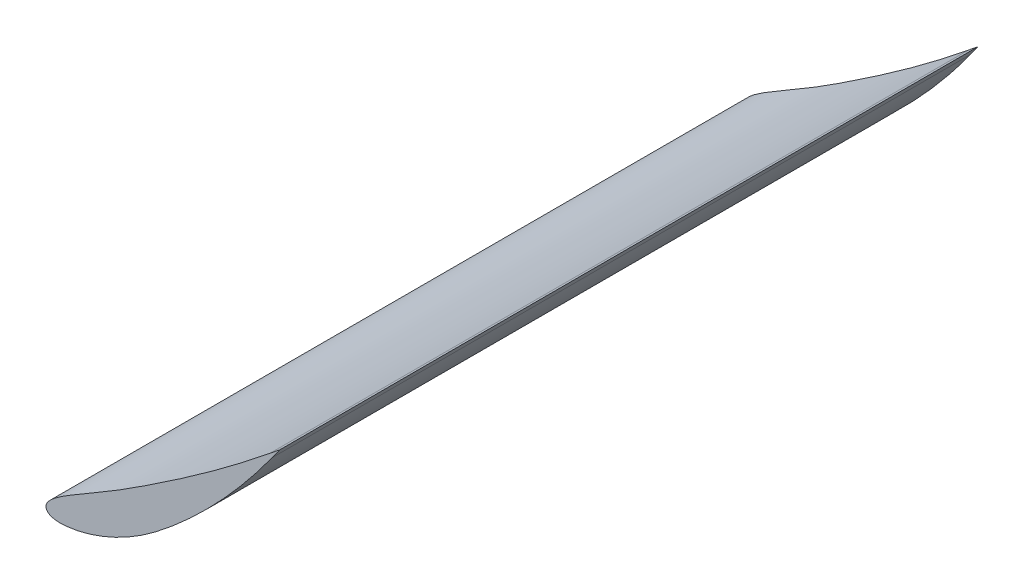
ISO-10303-21;
HEADER;
FILE_DESCRIPTION(('STEP AP214'),'2;1');
FILE_NAME('part.step','',(''),(''),'','','');
FILE_SCHEMA(('AUTOMOTIVE_DESIGN { 1 0 10303 214 1 1 1 1 }'));
ENDSEC;
DATA;
#1=APPLICATION_CONTEXT('core data for automotive mechanical design processes');
#2=APPLICATION_PROTOCOL_DEFINITION('international standard','automotive_design',2000,#1);
#3=PRODUCT_CONTEXT('',#1,'mechanical');
#4=PRODUCT('Part','Part','',(#3));
#5=PRODUCT_RELATED_PRODUCT_CATEGORY('part','',(#4));
#6=PRODUCT_DEFINITION_FORMATION('','',#4);
#7=PRODUCT_DEFINITION_CONTEXT('part definition',#1,'design');
#8=PRODUCT_DEFINITION('design','',#6,#7);
#9=PRODUCT_DEFINITION_SHAPE('','',#8);
#10=(LENGTH_UNIT() NAMED_UNIT(*) SI_UNIT(.MILLI.,.METRE.));
#11=(NAMED_UNIT(*) PLANE_ANGLE_UNIT() SI_UNIT($,.RADIAN.));
#12=(NAMED_UNIT(*) SI_UNIT($,.STERADIAN.) SOLID_ANGLE_UNIT());
#13=UNCERTAINTY_MEASURE_WITH_UNIT(LENGTH_MEASURE(1.E-05),#10,'distance_accuracy_value','');
#14=(GEOMETRIC_REPRESENTATION_CONTEXT(3) GLOBAL_UNCERTAINTY_ASSIGNED_CONTEXT((#13)) GLOBAL_UNIT_ASSIGNED_CONTEXT((#10,
#11,#12)) REPRESENTATION_CONTEXT('',''));
#15=CARTESIAN_POINT('',(0.,0.,0.));
#16=DIRECTION('',(0.,0.,1.));
#17=DIRECTION('',(1.,0.,0.));
#18=AXIS2_PLACEMENT_3D('',#15,#16,#17);
#19=CARTESIAN_POINT('',(143.843221599865,104.508217857603,431.8));
#20=DIRECTION('',(-0.811249289421059,0.584700427923417,0.));
#21=DIRECTION('',(-0.584700427923417,-0.811249289421059,0.));
#22=AXIS2_PLACEMENT_3D('',#19,#20,#21);
#23=PLANE('',#22);
#24=DIRECTION('',(0.584700427923417,0.811249289421059,0.));
#25=VECTOR('',#24,1.);
#26=CARTESIAN_POINT('',(143.843221599865,104.508217857603,0.));
#27=LINE('',#26,#25);
#28=CARTESIAN_POINT('',(139.047000747878,97.8536464356186,0.));
#29=VERTEX_POINT('',#28);
#30=CARTESIAN_POINT('',(143.843221599865,104.508217857603,0.));
#31=VERTEX_POINT('',#30);
#32=EDGE_CURVE('E83',#29,#31,#27,.T.);
#33=ORIENTED_EDGE('',*,*,#32,.T.);
#34=DIRECTION('',(0.,0.,-1.));
#35=VECTOR('',#34,1.);
#36=CARTESIAN_POINT('',(143.843221599865,104.508217857603,431.8));
#37=LINE('',#36,#35);
#38=CARTESIAN_POINT('',(143.843221599865,104.508217857603,431.8));
#39=VERTEX_POINT('',#38);
#40=EDGE_CURVE('E11',#39,#31,#37,.T.);
#41=ORIENTED_EDGE('',*,*,#40,.F.);
#42=DIRECTION('',(0.584700427923417,0.811249289421059,0.));
#43=VECTOR('',#42,1.);
#44=CARTESIAN_POINT('',(143.843221599865,104.508217857603,431.8));
#45=LINE('',#44,#43);
#46=CARTESIAN_POINT('',(139.047000747878,97.8536464356186,431.8));
#47=VERTEX_POINT('',#46);
#48=EDGE_CURVE('E76',#47,#39,#45,.T.);
#49=ORIENTED_EDGE('',*,*,#48,.F.);
#50=DIRECTION('',(0.,0.,-1.));
#51=VECTOR('',#50,1.);
#52=CARTESIAN_POINT('',(139.047000747878,97.8536464356186,431.8));
#53=LINE('',#52,#51);
#54=EDGE_CURVE('E84',#47,#29,#53,.T.);
#55=ORIENTED_EDGE('',*,*,#54,.T.);
#56=EDGE_LOOP('',(#33,#41,#49,#55));
#57=FACE_BOUND('',#56,.T.);
#58=ADVANCED_FACE('F32',(#57),#23,.F.);
#59=CARTESIAN_POINT('',(137.784553457694,99.6281930836956,431.8));
#60=DIRECTION('',(0.627285179942661,-0.778789639777202,0.));
#61=DIRECTION('',(0.778789639777202,0.627285179942661,0.));
#62=AXIS2_PLACEMENT_3D('',#59,#60,#61);
#63=PLANE('',#62);
#64=DIRECTION('',(-0.778789639777202,-0.627285179942661,0.));
#65=VECTOR('',#64,1.);
#66=CARTESIAN_POINT('',(137.784553457694,99.6281930836956,0.));
#67=LINE('',#66,#65);
#68=CARTESIAN_POINT('',(137.784553457694,99.6281930836956,0.));
#69=VERTEX_POINT('',#68);
#70=EDGE_CURVE('E63',#31,#69,#67,.T.);
#71=ORIENTED_EDGE('',*,*,#70,.T.);
#72=DIRECTION('',(0.,0.,-1.));
#73=VECTOR('',#72,1.);
#74=CARTESIAN_POINT('',(137.784553457694,99.6281930836956,431.8));
#75=LINE('',#74,#73);
#76=CARTESIAN_POINT('',(137.784553457694,99.6281930836956,431.8));
#77=VERTEX_POINT('',#76);
#78=EDGE_CURVE('E41',#77,#69,#75,.T.);
#79=ORIENTED_EDGE('',*,*,#78,.F.);
#80=DIRECTION('',(-0.778789639777202,-0.627285179942661,0.));
#81=VECTOR('',#80,1.);
#82=CARTESIAN_POINT('',(137.784553457694,99.6281930836956,431.8));
#83=LINE('',#82,#81);
#84=EDGE_CURVE('E72',#39,#77,#83,.T.);
#85=ORIENTED_EDGE('',*,*,#84,.F.);
#86=ORIENTED_EDGE('',*,*,#40,.T.);
#87=EDGE_LOOP('',(#71,#79,#85,#86));
#88=FACE_BOUND('',#87,.T.);
#89=ADVANCED_FACE('F73',(#88),#63,.F.);
#90=CARTESIAN_POINT('',(137.784553457694,99.6281930836956,431.8));
#91=CARTESIAN_POINT('',(136.358463718581,98.4795325046084,431.8));
#92=CARTESIAN_POINT('',(134.931220805424,97.3323242077274,431.8));
#93=CARTESIAN_POINT('',(132.068960749496,95.047698308943,431.8));
#94=CARTESIAN_POINT('',(130.634782352194,93.9092244093156,431.8));
#95=CARTESIAN_POINT('',(126.321970426487,90.5067450045274,431.8));
#96=CARTESIAN_POINT('',(123.433218001229,88.2550705130964,431.8));
#97=CARTESIAN_POINT('',(114.729322122103,81.5577766639632,431.8));
#98=CARTESIAN_POINT('',(108.873662808761,77.1706861996147,431.8));
#99=CARTESIAN_POINT('',(97.0542965696537,68.5548687006977,431.8));
#100=CARTESIAN_POINT('',(91.090033772149,64.3269563972762,431.8));
#101=CARTESIAN_POINT('',(79.0673799388344,56.009093845518,431.8));
#102=CARTESIAN_POINT('',(73.0088339385129,51.9193707258615,431.8));
#103=CARTESIAN_POINT('',(63.8781847845342,45.8475614270952,431.8));
#104=CARTESIAN_POINT('',(60.8261244134371,43.8360989043782,431.8));
#105=CARTESIAN_POINT('',(56.2474247472503,40.8197978811318,431.8));
#106=CARTESIAN_POINT('',(54.7205596228218,39.8152903745768,431.8));
#107=CARTESIAN_POINT('',(51.652796568542,37.8268429903687,431.8));
#108=CARTESIAN_POINT('',(50.1114211005133,36.8436030317796,431.8));
#109=CARTESIAN_POINT('',(45.4677554479368,33.9225214788474,431.8));
#110=CARTESIAN_POINT('',(42.346090536312,32.0130770712828,431.8));
#111=CARTESIAN_POINT('',(36.0654389409059,28.2488901020485,431.8));
#112=CARTESIAN_POINT('',(32.9063108711335,26.3943404281253,431.8));
#113=CARTESIAN_POINT('',(26.5741077121532,22.7057406786321,431.8));
#114=CARTESIAN_POINT('',(23.4009226252118,20.8729176896443,431.8));
#115=CARTESIAN_POINT('',(18.6615699788329,18.0905901078647,431.8));
#116=CARTESIAN_POINT('',(17.0853640982753,17.1573498679372,431.8));
#117=CARTESIAN_POINT('',(13.9500974787482,15.263090377093,431.8));
#118=CARTESIAN_POINT('',(12.3906634371098,14.3026759610142,431.8));
#119=CARTESIAN_POINT('',(9.30690005919732,12.3249695585487,431.8));
#120=CARTESIAN_POINT('',(7.78154030748488,11.3093470784555,431.8));
#121=CARTESIAN_POINT('',(5.55221749219606,9.6907788290836,431.8));
#122=CARTESIAN_POINT('',(4.8173326080933,9.13435775544304,431.8));
#123=CARTESIAN_POINT('',(3.39347156604328,7.97537522056973,431.8));
#124=CARTESIAN_POINT('',(2.70200321534684,7.37433709357121,431.8));
#125=CARTESIAN_POINT('',(1.72721910869358,6.40705271504195,431.8));
#126=CARTESIAN_POINT('',(1.41237545264393,6.07400564153932,431.8));
#127=CARTESIAN_POINT('',(0.814412641203767,5.37450529424434,431.8));
#128=CARTESIAN_POINT('',(0.530002704891935,5.00441811653039,431.8));
#129=CARTESIAN_POINT('',(0.0237547448850238,4.22978289474427,431.8));
#130=CARTESIAN_POINT('',(-0.197823237126348,3.8251233345892,431.8));
#131=CARTESIAN_POINT('',(-0.444705176246175,3.17113985199557,431.8));
#132=CARTESIAN_POINT('',(-0.512032745214236,2.94693107555639,431.8));
#133=CARTESIAN_POINT('',(-0.608401583925394,2.49438243969035,431.8));
#134=CARTESIAN_POINT('',(-0.637982246671744,2.2646957604029,431.8));
#135=CARTESIAN_POINT('',(-0.650144331383379,1.79670164870355,431.8));
#136=CARTESIAN_POINT('',(-0.63191763416311,1.56416997474963,431.8));
#137=CARTESIAN_POINT('',(-0.54392054861665,1.11083063247732,431.8));
#138=CARTESIAN_POINT('',(-0.473991290604151,0.886144823517372,431.8));
#139=CARTESIAN_POINT('',(-0.290287629389124,0.457696526369943,431.8));
#140=CARTESIAN_POINT('',(-0.177876177998187,0.25540267737846,431.8));
#141=CARTESIAN_POINT('',(0.0863297549741681,-0.126331907035813,431.8));
#142=CARTESIAN_POINT('',(0.239639206822399,-0.30613539307769,431.8));
#143=CARTESIAN_POINT('',(0.569719501571165,-0.631727538181567,431.8));
#144=CARTESIAN_POINT('',(0.747675380191441,-0.779600052246395,431.8));
#145=CARTESIAN_POINT('',(1.12454772459888,-1.05112604526825,431.8));
#146=CARTESIAN_POINT('',(1.3239737460091,-1.17506675078915,431.8));
#147=CARTESIAN_POINT('',(1.93467631747009,-1.50830140450362,431.8));
#148=CARTESIAN_POINT('',(2.36323151549919,-1.6821046451141,431.8));
#149=CARTESIAN_POINT('',(3.24663011794105,-1.97036892977408,431.8));
#150=CARTESIAN_POINT('',(3.6979118436324,-2.08351821986011,431.8));
#151=CARTESIAN_POINT('',(4.60519988517427,-2.26324387937183,431.8));
#152=CARTESIAN_POINT('',(5.06277853565119,-2.33099821596889,431.8));
#153=CARTESIAN_POINT('',(5.98350332037231,-2.43522346836576,431.8));
#154=CARTESIAN_POINT('',(6.44720473151933,-2.4709314595374,431.8));
#155=CARTESIAN_POINT('',(7.37009956471928,-2.51685407605895,431.8));
#156=CARTESIAN_POINT('',(7.83060330406271,-2.52757659684171,431.8));
#157=CARTESIAN_POINT('',(9.20982025848415,-2.52998927791443,431.8));
#158=CARTESIAN_POINT('',(10.1262360905439,-2.49188410052522,431.8));
#159=CARTESIAN_POINT('',(11.9548323291918,-2.36074344847994,431.8));
#160=CARTESIAN_POINT('',(12.8669352566974,-2.26670312812774,431.8));
#161=CARTESIAN_POINT('',(14.6877572476375,-2.03473630395475,431.8));
#162=CARTESIAN_POINT('',(15.5964507691502,-1.89647854052667,431.8));
#163=CARTESIAN_POINT('',(17.4109054282078,-1.58193218910781,431.8));
#164=CARTESIAN_POINT('',(18.3167926113543,-1.40574085275592,431.8));
#165=CARTESIAN_POINT('',(21.0147299916614,-0.830346646214407,431.8));
#166=CARTESIAN_POINT('',(22.7931210479803,-0.384210326939589,431.8));
#167=CARTESIAN_POINT('',(28.0787079455708,1.10746319926286,431.8));
#168=CARTESIAN_POINT('',(31.5367957022662,2.30478696281486,431.8));
#169=CARTESIAN_POINT('',(36.6440310173161,4.34772150471258,431.8));
#170=CARTESIAN_POINT('',(38.3354501193901,5.07162311607928,431.8));
#171=CARTESIAN_POINT('',(41.6809640335901,6.59305686204068,431.8));
#172=CARTESIAN_POINT('',(43.3309295706313,7.38857734825586,431.8));
#173=CARTESIAN_POINT('',(48.2174788847455,9.87187322796023,431.8));
#174=CARTESIAN_POINT('',(51.3908809206189,11.6561302306906,431.8));
#175=CARTESIAN_POINT('',(57.5864592904897,15.4555732798683,431.8));
#176=CARTESIAN_POINT('',(60.6087724291841,17.470550418852,431.8));
#177=CARTESIAN_POINT('',(66.512958078256,21.7149644056766,431.8));
#178=CARTESIAN_POINT('',(69.3888867867938,23.9534777296582,431.8));
#179=CARTESIAN_POINT('',(73.6557371982849,27.3830841452018,431.8));
#180=CARTESIAN_POINT('',(75.0687062749114,28.540509818755,431.8));
#181=CARTESIAN_POINT('',(77.8752915335134,30.8849139826075,431.8));
#182=CARTESIAN_POINT('',(79.2681085595334,32.0709435140133,431.8));
#183=CARTESIAN_POINT('',(86.167656528378,38.0516258694007,431.8));
#184=CARTESIAN_POINT('',(91.4971009486387,43.0102345482623,431.8));
#185=CARTESIAN_POINT('',(101.831514049061,53.2244074750561,431.8));
#186=CARTESIAN_POINT('',(106.835952778549,58.4804567262861,431.8));
#187=CARTESIAN_POINT('',(116.54694306649,69.2651773186637,431.8));
#188=CARTESIAN_POINT('',(121.25302032767,74.7942827299116,431.8));
#189=CARTESIAN_POINT('',(128.092436912677,83.2890065185775,431.8));
#190=CARTESIAN_POINT('',(130.335340863097,86.1543529125498,431.8));
#191=CARTESIAN_POINT('',(133.644147553595,90.5032103711563,431.8));
#192=CARTESIAN_POINT('',(134.737771553584,91.9613513341311,431.8));
#193=CARTESIAN_POINT('',(136.906284890966,94.8947789560615,431.8));
#194=CARTESIAN_POINT('',(137.979095039588,96.3719684589219,431.8));
#195=CARTESIAN_POINT('',(139.047000747878,97.8536464356186,431.8));
#196=B_SPLINE_CURVE_WITH_KNOTS('',3,(#90,#91,#92,#93,#94,#95,#96,#97,#98,#99,#100,#101,#102,
#103,#104,#105,#106,#107,#108,#109,#110,#111,#112,#113,#114,#115,#116,#117,#118,#119,#120,#121,
#122,#123,#124,#125,#126,#127,#128,#129,#130,#131,#132,#133,#134,#135,#136,#137,#138,#139,#140,
#141,#142,#143,#144,#145,#146,#147,#148,#149,#150,#151,#152,#153,#154,#155,#156,#157,#158,#159,
#160,#161,#162,#163,#164,#165,#166,#167,#168,#169,#170,#171,#172,#173,#174,#175,#176,#177,#178,
#179,#180,#181,#182,#183,#184,#185,#186,#187,#188,#189,#190,#191,#192,#193,#194,#195),
.UNSPECIFIED.,.F.,.F.,(4,2,2,2,2,2,2,2,2,2,2,2,2,2,2,2,2,2,2,2,2,2,2,2,2,2,2,2,2,2,2,2,2,2,2,2,
2,2,2,2,2,2,2,2,2,2,2,2,2,2,2,2,4),(0.,0.0156250000000021,0.0312500000000041,0.0625000000000074,
0.125000000000013,0.187500000000019,0.250000000000025,0.281250000000028,0.29687500000003,
0.312500000000031,0.343750000000034,0.375000000000038,0.406250000000041,0.421875000000042,
0.437500000000043,0.453125000000045,0.460937500000045,0.468750000000046,0.472656250000046,
0.476562500000047,0.480468750000047,0.482421875000047,0.484375000000047,0.486328125000047,
0.488281250000047,0.490234375000047,0.492187500000047,0.494140625000047,0.496093750000047,
0.500000000000047,0.503906250000047,0.507812500000047,0.511718750000046,0.515625000000046,
0.523437500000045,0.531250000000044,0.539062500000044,0.546875000000043,0.562500000000041,
0.593750000000038,0.609375000000036,0.625000000000034,0.656250000000031,0.687500000000028,
0.718750000000026,0.734375000000024,0.750000000000023,0.812500000000017,0.875000000000011,
0.937500000000006,0.968750000000003,0.984375000000001,1.),.UNSPECIFIED.);
#197=DIRECTION('',(0.,0.,-1.));
#198=VECTOR('',#197,1.);
#199=SURFACE_OF_LINEAR_EXTRUSION('',#196,#198);
#200=CARTESIAN_POINT('',(137.784553457694,99.6281930836956,0.));
#201=CARTESIAN_POINT('',(136.358463718581,98.4795325046084,0.));
#202=CARTESIAN_POINT('',(134.931220805424,97.3323242077274,0.));
#203=CARTESIAN_POINT('',(132.068960749496,95.047698308943,0.));
#204=CARTESIAN_POINT('',(130.634782352194,93.9092244093156,0.));
#205=CARTESIAN_POINT('',(126.321970426487,90.5067450045274,0.));
#206=CARTESIAN_POINT('',(123.433218001229,88.2550705130964,0.));
#207=CARTESIAN_POINT('',(114.729322122103,81.5577766639632,0.));
#208=CARTESIAN_POINT('',(108.873662808761,77.1706861996147,0.));
#209=CARTESIAN_POINT('',(97.0542965696537,68.5548687006977,0.));
#210=CARTESIAN_POINT('',(91.090033772149,64.3269563972762,0.));
#211=CARTESIAN_POINT('',(79.0673799388344,56.009093845518,0.));
#212=CARTESIAN_POINT('',(73.0088339385129,51.9193707258615,0.));
#213=CARTESIAN_POINT('',(63.8781847845342,45.8475614270952,0.));
#214=CARTESIAN_POINT('',(60.8261244134371,43.8360989043782,0.));
#215=CARTESIAN_POINT('',(56.2474247472503,40.8197978811318,0.));
#216=CARTESIAN_POINT('',(54.7205596228218,39.8152903745768,0.));
#217=CARTESIAN_POINT('',(51.652796568542,37.8268429903687,0.));
#218=CARTESIAN_POINT('',(50.1114211005133,36.8436030317796,0.));
#219=CARTESIAN_POINT('',(45.4677554479368,33.9225214788474,0.));
#220=CARTESIAN_POINT('',(42.346090536312,32.0130770712828,0.));
#221=CARTESIAN_POINT('',(36.0654389409059,28.2488901020485,0.));
#222=CARTESIAN_POINT('',(32.9063108711335,26.3943404281253,0.));
#223=CARTESIAN_POINT('',(26.5741077121532,22.7057406786321,0.));
#224=CARTESIAN_POINT('',(23.4009226252118,20.8729176896443,0.));
#225=CARTESIAN_POINT('',(18.6615699788329,18.0905901078647,0.));
#226=CARTESIAN_POINT('',(17.0853640982753,17.1573498679372,0.));
#227=CARTESIAN_POINT('',(13.9500974787482,15.263090377093,0.));
#228=CARTESIAN_POINT('',(12.3906634371098,14.3026759610142,0.));
#229=CARTESIAN_POINT('',(9.30690005919732,12.3249695585487,0.));
#230=CARTESIAN_POINT('',(7.78154030748488,11.3093470784555,0.));
#231=CARTESIAN_POINT('',(5.55221749219606,9.6907788290836,0.));
#232=CARTESIAN_POINT('',(4.8173326080933,9.13435775544304,0.));
#233=CARTESIAN_POINT('',(3.39347156604328,7.97537522056973,0.));
#234=CARTESIAN_POINT('',(2.70200321534684,7.37433709357121,0.));
#235=CARTESIAN_POINT('',(1.72721910869358,6.40705271504195,0.));
#236=CARTESIAN_POINT('',(1.41237545264393,6.07400564153932,0.));
#237=CARTESIAN_POINT('',(0.814412641203767,5.37450529424434,0.));
#238=CARTESIAN_POINT('',(0.530002704891935,5.00441811653039,0.));
#239=CARTESIAN_POINT('',(0.0237547448850238,4.22978289474427,0.));
#240=CARTESIAN_POINT('',(-0.197823237126348,3.8251233345892,0.));
#241=CARTESIAN_POINT('',(-0.444705176246175,3.17113985199557,0.));
#242=CARTESIAN_POINT('',(-0.512032745214236,2.94693107555639,0.));
#243=CARTESIAN_POINT('',(-0.608401583925394,2.49438243969035,0.));
#244=CARTESIAN_POINT('',(-0.637982246671744,2.2646957604029,0.));
#245=CARTESIAN_POINT('',(-0.650144331383379,1.79670164870355,0.));
#246=CARTESIAN_POINT('',(-0.63191763416311,1.56416997474963,0.));
#247=CARTESIAN_POINT('',(-0.54392054861665,1.11083063247732,0.));
#248=CARTESIAN_POINT('',(-0.473991290604151,0.886144823517372,0.));
#249=CARTESIAN_POINT('',(-0.290287629389124,0.457696526369943,0.));
#250=CARTESIAN_POINT('',(-0.177876177998187,0.25540267737846,0.));
#251=CARTESIAN_POINT('',(0.0863297549741681,-0.126331907035813,0.));
#252=CARTESIAN_POINT('',(0.239639206822399,-0.30613539307769,0.));
#253=CARTESIAN_POINT('',(0.569719501571165,-0.631727538181567,0.));
#254=CARTESIAN_POINT('',(0.747675380191441,-0.779600052246395,0.));
#255=CARTESIAN_POINT('',(1.12454772459888,-1.05112604526825,0.));
#256=CARTESIAN_POINT('',(1.3239737460091,-1.17506675078915,0.));
#257=CARTESIAN_POINT('',(1.93467631747009,-1.50830140450362,0.));
#258=CARTESIAN_POINT('',(2.36323151549919,-1.6821046451141,0.));
#259=CARTESIAN_POINT('',(3.24663011794105,-1.97036892977408,0.));
#260=CARTESIAN_POINT('',(3.6979118436324,-2.08351821986011,0.));
#261=CARTESIAN_POINT('',(4.60519988517427,-2.26324387937183,0.));
#262=CARTESIAN_POINT('',(5.06277853565119,-2.33099821596889,0.));
#263=CARTESIAN_POINT('',(5.98350332037231,-2.43522346836576,0.));
#264=CARTESIAN_POINT('',(6.44720473151933,-2.4709314595374,0.));
#265=CARTESIAN_POINT('',(7.37009956471928,-2.51685407605895,0.));
#266=CARTESIAN_POINT('',(7.83060330406271,-2.52757659684171,0.));
#267=CARTESIAN_POINT('',(9.20982025848415,-2.52998927791443,0.));
#268=CARTESIAN_POINT('',(10.1262360905439,-2.49188410052522,0.));
#269=CARTESIAN_POINT('',(11.9548323291918,-2.36074344847994,0.));
#270=CARTESIAN_POINT('',(12.8669352566974,-2.26670312812774,0.));
#271=CARTESIAN_POINT('',(14.6877572476375,-2.03473630395475,0.));
#272=CARTESIAN_POINT('',(15.5964507691502,-1.89647854052667,0.));
#273=CARTESIAN_POINT('',(17.4109054282078,-1.58193218910781,0.));
#274=CARTESIAN_POINT('',(18.3167926113543,-1.40574085275592,0.));
#275=CARTESIAN_POINT('',(21.0147299916614,-0.830346646214407,0.));
#276=CARTESIAN_POINT('',(22.7931210479803,-0.384210326939589,0.));
#277=CARTESIAN_POINT('',(28.0787079455708,1.10746319926286,0.));
#278=CARTESIAN_POINT('',(31.5367957022662,2.30478696281486,0.));
#279=CARTESIAN_POINT('',(36.6440310173161,4.34772150471258,0.));
#280=CARTESIAN_POINT('',(38.3354501193901,5.07162311607928,0.));
#281=CARTESIAN_POINT('',(41.6809640335901,6.59305686204068,0.));
#282=CARTESIAN_POINT('',(43.3309295706313,7.38857734825586,0.));
#283=CARTESIAN_POINT('',(48.2174788847455,9.87187322796023,0.));
#284=CARTESIAN_POINT('',(51.3908809206189,11.6561302306906,0.));
#285=CARTESIAN_POINT('',(57.5864592904897,15.4555732798683,0.));
#286=CARTESIAN_POINT('',(60.6087724291841,17.470550418852,0.));
#287=CARTESIAN_POINT('',(66.512958078256,21.7149644056766,0.));
#288=CARTESIAN_POINT('',(69.3888867867938,23.9534777296582,0.));
#289=CARTESIAN_POINT('',(73.6557371982849,27.3830841452018,0.));
#290=CARTESIAN_POINT('',(75.0687062749114,28.540509818755,0.));
#291=CARTESIAN_POINT('',(77.8752915335134,30.8849139826075,0.));
#292=CARTESIAN_POINT('',(79.2681085595334,32.0709435140133,0.));
#293=CARTESIAN_POINT('',(86.167656528378,38.0516258694007,0.));
#294=CARTESIAN_POINT('',(91.4971009486387,43.0102345482623,0.));
#295=CARTESIAN_POINT('',(101.831514049061,53.2244074750561,0.));
#296=CARTESIAN_POINT('',(106.835952778549,58.4804567262861,0.));
#297=CARTESIAN_POINT('',(116.54694306649,69.2651773186637,0.));
#298=CARTESIAN_POINT('',(121.25302032767,74.7942827299116,0.));
#299=CARTESIAN_POINT('',(128.092436912677,83.2890065185775,0.));
#300=CARTESIAN_POINT('',(130.335340863097,86.1543529125498,0.));
#301=CARTESIAN_POINT('',(133.644147553595,90.5032103711563,0.));
#302=CARTESIAN_POINT('',(134.737771553584,91.9613513341311,0.));
#303=CARTESIAN_POINT('',(136.906284890966,94.8947789560615,0.));
#304=CARTESIAN_POINT('',(137.979095039588,96.3719684589219,0.));
#305=CARTESIAN_POINT('',(139.047000747878,97.8536464356186,0.));
#306=B_SPLINE_CURVE_WITH_KNOTS('',3,(#200,#201,#202,#203,#204,#205,#206,#207,#208,#209,#210,
#211,#212,#213,#214,#215,#216,#217,#218,#219,#220,#221,#222,#223,#224,#225,#226,#227,#228,#229,
#230,#231,#232,#233,#234,#235,#236,#237,#238,#239,#240,#241,#242,#243,#244,#245,#246,#247,#248,
#249,#250,#251,#252,#253,#254,#255,#256,#257,#258,#259,#260,#261,#262,#263,#264,#265,#266,#267,
#268,#269,#270,#271,#272,#273,#274,#275,#276,#277,#278,#279,#280,#281,#282,#283,#284,#285,#286,
#287,#288,#289,#290,#291,#292,#293,#294,#295,#296,#297,#298,#299,#300,#301,#302,#303,#304,#305),
.UNSPECIFIED.,.F.,.F.,(4,2,2,2,2,2,2,2,2,2,2,2,2,2,2,2,2,2,2,2,2,2,2,2,2,2,2,2,2,2,2,2,2,2,2,2,
2,2,2,2,2,2,2,2,2,2,2,2,2,2,2,2,4),(0.,0.0156250000000021,0.0312500000000041,0.0625000000000074,
0.125000000000013,0.187500000000019,0.250000000000025,0.281250000000028,0.29687500000003,
0.312500000000031,0.343750000000034,0.375000000000038,0.406250000000041,0.421875000000042,
0.437500000000043,0.453125000000045,0.460937500000045,0.468750000000046,0.472656250000046,
0.476562500000047,0.480468750000047,0.482421875000047,0.484375000000047,0.486328125000047,
0.488281250000047,0.490234375000047,0.492187500000047,0.494140625000047,0.496093750000047,
0.500000000000047,0.503906250000047,0.507812500000047,0.511718750000046,0.515625000000046,
0.523437500000045,0.531250000000044,0.539062500000044,0.546875000000043,0.562500000000041,
0.593750000000038,0.609375000000036,0.625000000000034,0.656250000000031,0.687500000000028,
0.718750000000026,0.734375000000024,0.750000000000023,0.812500000000017,0.875000000000011,
0.937500000000006,0.968750000000003,0.984375000000001,1.),.UNSPECIFIED.);
#307=EDGE_CURVE('E68',#69,#29,#306,.T.);
#308=ORIENTED_EDGE('',*,*,#307,.T.);
#309=ORIENTED_EDGE('',*,*,#54,.F.);
#310=CARTESIAN_POINT('',(139.047000747878,97.8536464356186,431.8));
#311=CARTESIAN_POINT('',(137.979095039588,96.3719684589219,431.8));
#312=CARTESIAN_POINT('',(136.906284890966,94.8947789560615,431.8));
#313=CARTESIAN_POINT('',(134.737771553584,91.9613513341311,431.8));
#314=CARTESIAN_POINT('',(133.644147553595,90.5032103711563,431.8));
#315=CARTESIAN_POINT('',(130.335340863097,86.1543529125498,431.8));
#316=CARTESIAN_POINT('',(128.092436912677,83.2890065185775,431.8));
#317=CARTESIAN_POINT('',(121.25302032767,74.7942827299116,431.8));
#318=CARTESIAN_POINT('',(116.54694306649,69.2651773186637,431.8));
#319=CARTESIAN_POINT('',(106.835952778549,58.4804567262861,431.8));
#320=CARTESIAN_POINT('',(101.831514049061,53.2244074750561,431.8));
#321=CARTESIAN_POINT('',(91.4971009486387,43.0102345482623,431.8));
#322=CARTESIAN_POINT('',(86.167656528378,38.0516258694007,431.8));
#323=CARTESIAN_POINT('',(79.2681085595334,32.0709435140133,431.8));
#324=CARTESIAN_POINT('',(77.8752915335134,30.8849139826075,431.8));
#325=CARTESIAN_POINT('',(75.0687062749114,28.540509818755,431.8));
#326=CARTESIAN_POINT('',(73.6557371982849,27.3830841452018,431.8));
#327=CARTESIAN_POINT('',(69.3888867867938,23.9534777296582,431.8));
#328=CARTESIAN_POINT('',(66.512958078256,21.7149644056766,431.8));
#329=CARTESIAN_POINT('',(60.6087724291841,17.470550418852,431.8));
#330=CARTESIAN_POINT('',(57.5864592904897,15.4555732798683,431.8));
#331=CARTESIAN_POINT('',(51.3908809206189,11.6561302306906,431.8));
#332=CARTESIAN_POINT('',(48.2174788847455,9.87187322796023,431.8));
#333=CARTESIAN_POINT('',(43.3309295706313,7.38857734825586,431.8));
#334=CARTESIAN_POINT('',(41.6809640335901,6.59305686204068,431.8));
#335=CARTESIAN_POINT('',(38.3354501193901,5.07162311607928,431.8));
#336=CARTESIAN_POINT('',(36.6440310173161,4.34772150471258,431.8));
#337=CARTESIAN_POINT('',(31.5367957022662,2.30478696281486,431.8));
#338=CARTESIAN_POINT('',(28.0787079455708,1.10746319926286,431.8));
#339=CARTESIAN_POINT('',(22.7931210479803,-0.384210326939589,431.8));
#340=CARTESIAN_POINT('',(21.0147299916614,-0.830346646214407,431.8));
#341=CARTESIAN_POINT('',(18.3167926113543,-1.40574085275592,431.8));
#342=CARTESIAN_POINT('',(17.4109054282078,-1.58193218910781,431.8));
#343=CARTESIAN_POINT('',(15.5964507691502,-1.89647854052667,431.8));
#344=CARTESIAN_POINT('',(14.6877572476375,-2.03473630395475,431.8));
#345=CARTESIAN_POINT('',(12.8669352566974,-2.26670312812774,431.8));
#346=CARTESIAN_POINT('',(11.9548323291918,-2.36074344847994,431.8));
#347=CARTESIAN_POINT('',(10.1262360905439,-2.49188410052522,431.8));
#348=CARTESIAN_POINT('',(9.20982025848415,-2.52998927791443,431.8));
#349=CARTESIAN_POINT('',(7.83060330406271,-2.52757659684171,431.8));
#350=CARTESIAN_POINT('',(7.37009956471928,-2.51685407605895,431.8));
#351=CARTESIAN_POINT('',(6.44720473151933,-2.4709314595374,431.8));
#352=CARTESIAN_POINT('',(5.98350332037231,-2.43522346836576,431.8));
#353=CARTESIAN_POINT('',(5.06277853565119,-2.33099821596889,431.8));
#354=CARTESIAN_POINT('',(4.60519988517427,-2.26324387937183,431.8));
#355=CARTESIAN_POINT('',(3.6979118436324,-2.08351821986011,431.8));
#356=CARTESIAN_POINT('',(3.24663011794105,-1.97036892977408,431.8));
#357=CARTESIAN_POINT('',(2.36323151549919,-1.6821046451141,431.8));
#358=CARTESIAN_POINT('',(1.93467631747009,-1.50830140450362,431.8));
#359=CARTESIAN_POINT('',(1.3239737460091,-1.17506675078915,431.8));
#360=CARTESIAN_POINT('',(1.12454772459888,-1.05112604526825,431.8));
#361=CARTESIAN_POINT('',(0.747675380191441,-0.779600052246395,431.8));
#362=CARTESIAN_POINT('',(0.569719501571165,-0.631727538181567,431.8));
#363=CARTESIAN_POINT('',(0.239639206822399,-0.30613539307769,431.8));
#364=CARTESIAN_POINT('',(0.0863297549741681,-0.126331907035813,431.8));
#365=CARTESIAN_POINT('',(-0.177876177998187,0.25540267737846,431.8));
#366=CARTESIAN_POINT('',(-0.290287629389124,0.457696526369943,431.8));
#367=CARTESIAN_POINT('',(-0.473991290604151,0.886144823517372,431.8));
#368=CARTESIAN_POINT('',(-0.54392054861665,1.11083063247732,431.8));
#369=CARTESIAN_POINT('',(-0.63191763416311,1.56416997474963,431.8));
#370=CARTESIAN_POINT('',(-0.650144331383379,1.79670164870355,431.8));
#371=CARTESIAN_POINT('',(-0.637982246671744,2.2646957604029,431.8));
#372=CARTESIAN_POINT('',(-0.608401583925394,2.49438243969035,431.8));
#373=CARTESIAN_POINT('',(-0.512032745214236,2.94693107555639,431.8));
#374=CARTESIAN_POINT('',(-0.444705176246175,3.17113985199557,431.8));
#375=CARTESIAN_POINT('',(-0.197823237126348,3.8251233345892,431.8));
#376=CARTESIAN_POINT('',(0.0237547448850238,4.22978289474427,431.8));
#377=CARTESIAN_POINT('',(0.530002704891935,5.00441811653039,431.8));
#378=CARTESIAN_POINT('',(0.814412641203767,5.37450529424434,431.8));
#379=CARTESIAN_POINT('',(1.41237545264393,6.07400564153932,431.8));
#380=CARTESIAN_POINT('',(1.72721910869358,6.40705271504195,431.8));
#381=CARTESIAN_POINT('',(2.70200321534684,7.37433709357121,431.8));
#382=CARTESIAN_POINT('',(3.39347156604328,7.97537522056973,431.8));
#383=CARTESIAN_POINT('',(4.8173326080933,9.13435775544304,431.8));
#384=CARTESIAN_POINT('',(5.55221749219606,9.6907788290836,431.8));
#385=CARTESIAN_POINT('',(7.78154030748488,11.3093470784555,431.8));
#386=CARTESIAN_POINT('',(9.30690005919732,12.3249695585487,431.8));
#387=CARTESIAN_POINT('',(12.3906634371098,14.3026759610142,431.8));
#388=CARTESIAN_POINT('',(13.9500974787482,15.263090377093,431.8));
#389=CARTESIAN_POINT('',(17.0853640982753,17.1573498679372,431.8));
#390=CARTESIAN_POINT('',(18.6615699788329,18.0905901078647,431.8));
#391=CARTESIAN_POINT('',(23.4009226252118,20.8729176896443,431.8));
#392=CARTESIAN_POINT('',(26.5741077121532,22.7057406786321,431.8));
#393=CARTESIAN_POINT('',(32.9063108711335,26.3943404281253,431.8));
#394=CARTESIAN_POINT('',(36.0654389409059,28.2488901020485,431.8));
#395=CARTESIAN_POINT('',(42.346090536312,32.0130770712828,431.8));
#396=CARTESIAN_POINT('',(45.4677554479368,33.9225214788474,431.8));
#397=CARTESIAN_POINT('',(50.1114211005133,36.8436030317796,431.8));
#398=CARTESIAN_POINT('',(51.652796568542,37.8268429903687,431.8));
#399=CARTESIAN_POINT('',(54.7205596228218,39.8152903745768,431.8));
#400=CARTESIAN_POINT('',(56.2474247472503,40.8197978811318,431.8));
#401=CARTESIAN_POINT('',(60.8261244134371,43.8360989043782,431.8));
#402=CARTESIAN_POINT('',(63.8781847845342,45.8475614270952,431.8));
#403=CARTESIAN_POINT('',(73.0088339385129,51.9193707258615,431.8));
#404=CARTESIAN_POINT('',(79.0673799388344,56.009093845518,431.8));
#405=CARTESIAN_POINT('',(91.090033772149,64.3269563972762,431.8));
#406=CARTESIAN_POINT('',(97.0542965696537,68.5548687006977,431.8));
#407=CARTESIAN_POINT('',(108.873662808761,77.1706861996147,431.8));
#408=CARTESIAN_POINT('',(114.729322122103,81.5577766639632,431.8));
#409=CARTESIAN_POINT('',(123.433218001229,88.2550705130964,431.8));
#410=CARTESIAN_POINT('',(126.321970426487,90.5067450045274,431.8));
#411=CARTESIAN_POINT('',(130.634782352194,93.9092244093156,431.8));
#412=CARTESIAN_POINT('',(132.068960749496,95.047698308943,431.8));
#413=CARTESIAN_POINT('',(134.931220805424,97.3323242077274,431.8));
#414=CARTESIAN_POINT('',(136.358463718581,98.4795325046084,431.8));
#415=CARTESIAN_POINT('',(137.784553457694,99.6281930836956,431.8));
#416=B_SPLINE_CURVE_WITH_KNOTS('',3,(#310,#311,#312,#313,#314,#315,#316,#317,#318,#319,#320,
#321,#322,#323,#324,#325,#326,#327,#328,#329,#330,#331,#332,#333,#334,#335,#336,#337,#338,#339,
#340,#341,#342,#343,#344,#345,#346,#347,#348,#349,#350,#351,#352,#353,#354,#355,#356,#357,#358,
#359,#360,#361,#362,#363,#364,#365,#366,#367,#368,#369,#370,#371,#372,#373,#374,#375,#376,#377,
#378,#379,#380,#381,#382,#383,#384,#385,#386,#387,#388,#389,#390,#391,#392,#393,#394,#395,#396,
#397,#398,#399,#400,#401,#402,#403,#404,#405,#406,#407,#408,#409,#410,#411,#412,#413,#414,#415),
.UNSPECIFIED.,.F.,.F.,(4,2,2,2,2,2,2,2,2,2,2,2,2,2,2,2,2,2,2,2,2,2,2,2,2,2,2,2,2,2,2,2,2,2,2,2,
2,2,2,2,2,2,2,2,2,2,2,2,2,2,2,2,4),(0.,0.0156249999999987,0.0312499999999972,0.0624999999999943,
0.124999999999989,0.187499999999983,0.249999999999977,0.265624999999976,0.281249999999974,
0.312499999999972,0.343749999999969,0.374999999999966,0.390624999999964,0.406249999999962,
0.437499999999959,0.453124999999957,0.460937499999956,0.468749999999956,0.476562499999955,
0.484374999999954,0.488281249999954,0.492187499999953,0.496093749999953,0.499999999999953,
0.503906249999953,0.505859374999953,0.507812499999953,0.509765624999953,0.511718749999953,
0.513671874999953,0.515624999999953,0.517578124999953,0.519531249999953,0.523437499999953,
0.527343749999954,0.531249999999954,0.539062499999955,0.546874999999955,0.562499999999957,
0.578124999999958,0.593749999999959,0.624999999999962,0.656249999999966,0.687499999999969,
0.70312499999997,0.718749999999972,0.749999999999975,0.812499999999981,0.874999999999987,
0.937499999999993,0.968749999999996,0.984374999999998,1.),.UNSPECIFIED.);
#417=EDGE_CURVE('E50',#77,#47,#416,.F.);
#418=ORIENTED_EDGE('',*,*,#417,.F.);
#419=ORIENTED_EDGE('',*,*,#78,.T.);
#420=EDGE_LOOP('',(#308,#309,#418,#419));
#421=FACE_BOUND('',#420,.T.);
#422=ADVANCED_FACE('F106',(#421),#199,.F.);
#423=CARTESIAN_POINT('',(2.80493081670411,-1.82623678743887,431.8));
#424=DIRECTION('',(0.,0.,1.));
#425=DIRECTION('',(1.,0.,0.));
#426=AXIS2_PLACEMENT_3D('',#423,#424,#425);
#427=PLANE('',#426);
#428=ORIENTED_EDGE('',*,*,#48,.T.);
#429=ORIENTED_EDGE('',*,*,#84,.T.);
#430=ORIENTED_EDGE('',*,*,#417,.T.);
#431=EDGE_LOOP('',(#428,#429,#430));
#432=FACE_BOUND('',#431,.T.);
#433=ADVANCED_FACE('F79',(#432),#427,.T.);
#434=CARTESIAN_POINT('',(2.80493081670411,-1.82623678743887,0.));
#435=DIRECTION('',(0.,0.,1.));
#436=DIRECTION('',(1.,0.,0.));
#437=AXIS2_PLACEMENT_3D('',#434,#435,#436);
#438=PLANE('',#437);
#439=ORIENTED_EDGE('',*,*,#32,.F.);
#440=ORIENTED_EDGE('',*,*,#307,.F.);
#441=ORIENTED_EDGE('',*,*,#70,.F.);
#442=EDGE_LOOP('',(#439,#440,#441));
#443=FACE_BOUND('',#442,.T.);
#444=ADVANCED_FACE('F95',(#443),#438,.F.);
#445=CLOSED_SHELL('',(#58,#89,#422,#433,#444));
#446=MANIFOLD_SOLID_BREP('B2',#445);
#447=ADVANCED_BREP_SHAPE_REPRESENTATION('',(#18,#446),#14);
#448=SHAPE_DEFINITION_REPRESENTATION(#9,#447);
ENDSEC;
END-ISO-10303-21;
